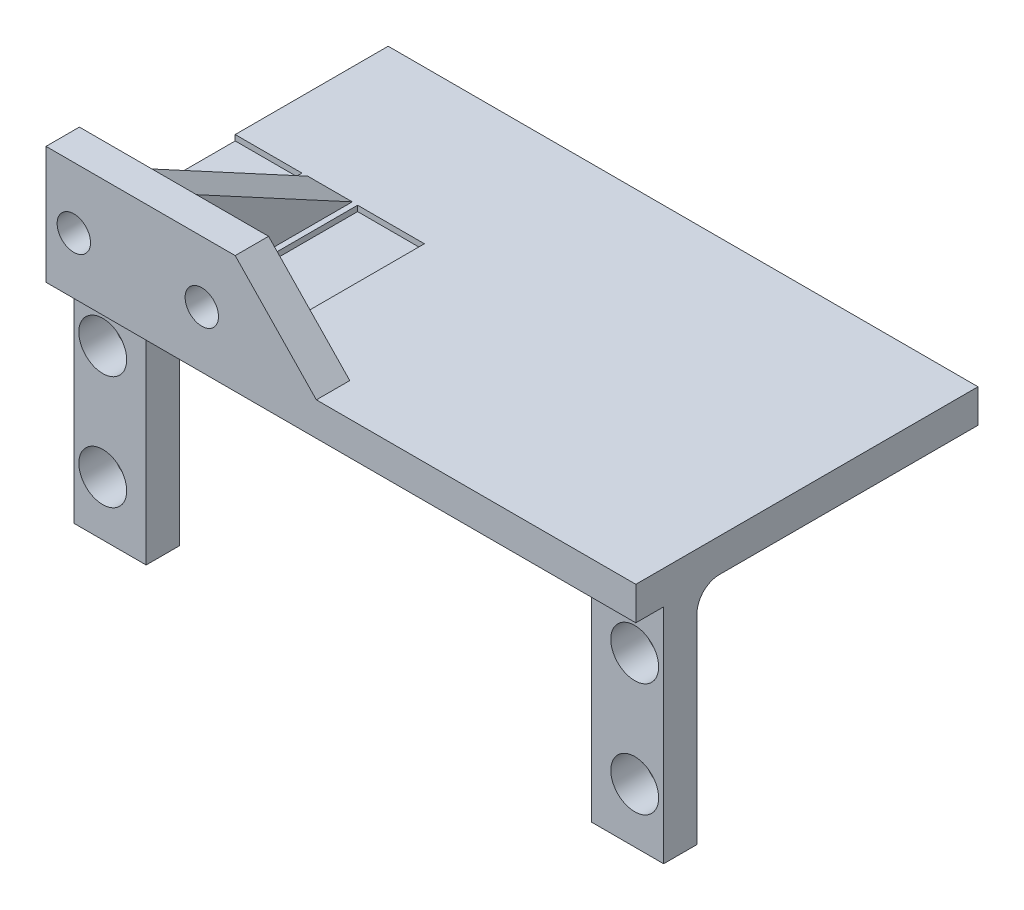
ISO-10303-21;
HEADER;
FILE_DESCRIPTION(('STEP AP214'),'2;1');
FILE_NAME('part.step','',(''),(''),'','','');
FILE_SCHEMA(('AUTOMOTIVE_DESIGN { 1 0 10303 214 1 1 1 1 }'));
ENDSEC;
DATA;
#1=APPLICATION_CONTEXT('core data for automotive mechanical design processes');
#2=APPLICATION_PROTOCOL_DEFINITION('international standard','automotive_design',2000,#1);
#3=PRODUCT_CONTEXT('',#1,'mechanical');
#4=PRODUCT('Part','Part','',(#3));
#5=PRODUCT_RELATED_PRODUCT_CATEGORY('part','',(#4));
#6=PRODUCT_DEFINITION_FORMATION('','',#4);
#7=PRODUCT_DEFINITION_CONTEXT('part definition',#1,'design');
#8=PRODUCT_DEFINITION('design','',#6,#7);
#9=PRODUCT_DEFINITION_SHAPE('','',#8);
#10=(LENGTH_UNIT() NAMED_UNIT(*) SI_UNIT(.MILLI.,.METRE.));
#11=(NAMED_UNIT(*) PLANE_ANGLE_UNIT() SI_UNIT($,.RADIAN.));
#12=(NAMED_UNIT(*) SI_UNIT($,.STERADIAN.) SOLID_ANGLE_UNIT());
#13=UNCERTAINTY_MEASURE_WITH_UNIT(LENGTH_MEASURE(1.E-05),#10,'distance_accuracy_value','');
#14=(GEOMETRIC_REPRESENTATION_CONTEXT(3) GLOBAL_UNCERTAINTY_ASSIGNED_CONTEXT((#13)) GLOBAL_UNIT_ASSIGNED_CONTEXT((#10,
#11,#12)) REPRESENTATION_CONTEXT('',''));
#15=CARTESIAN_POINT('',(0.,0.,0.));
#16=DIRECTION('',(0.,0.,1.));
#17=DIRECTION('',(1.,0.,0.));
#18=AXIS2_PLACEMENT_3D('',#15,#16,#17);
#19=CARTESIAN_POINT('',(0.,3.,0.));
#20=DIRECTION('',(0.,1.,0.));
#21=DIRECTION('',(0.,0.,1.));
#22=AXIS2_PLACEMENT_3D('',#19,#20,#21);
#23=PLANE('',#22);
#24=DIRECTION('',(0.,0.,1.));
#25=VECTOR('',#24,1.);
#26=CARTESIAN_POINT('',(21.9121082102589,3.,34.4908925903216));
#27=LINE('',#26,#25);
#28=CARTESIAN_POINT('',(21.9121082102589,3.,34.4908925903216));
#29=VERTEX_POINT('',#28);
#30=CARTESIAN_POINT('',(21.9121082102589,3.,37.4908925903216));
#31=VERTEX_POINT('',#30);
#32=EDGE_CURVE('E52',#29,#31,#27,.T.);
#33=ORIENTED_EDGE('',*,*,#32,.T.);
#34=DIRECTION('',(1.,0.,0.));
#35=VECTOR('',#34,1.);
#36=CARTESIAN_POINT('',(-2.38191084480889,3.,37.4908925903216));
#37=LINE('',#36,#35);
#38=CARTESIAN_POINT('',(50.6180891551911,3.,37.4908925903216));
#39=VERTEX_POINT('',#38);
#40=EDGE_CURVE('E407',#31,#39,#37,.T.);
#41=ORIENTED_EDGE('',*,*,#40,.T.);
#42=DIRECTION('',(0.,0.,-1.));
#43=VECTOR('',#42,1.);
#44=CARTESIAN_POINT('',(50.6180891551911,3.,6.74530636270987));
#45=LINE('',#44,#43);
#46=CARTESIAN_POINT('',(50.6180891551911,3.,6.74530636270987));
#47=VERTEX_POINT('',#46);
#48=EDGE_CURVE('E410',#39,#47,#45,.T.);
#49=ORIENTED_EDGE('',*,*,#48,.T.);
#50=DIRECTION('',(-1.,0.,0.));
#51=VECTOR('',#50,1.);
#52=CARTESIAN_POINT('',(-2.3819108448089,3.,6.74530636270987));
#53=LINE('',#52,#51);
#54=CARTESIAN_POINT('',(-2.3819108448089,3.,6.74530636270987));
#55=VERTEX_POINT('',#54);
#56=EDGE_CURVE('E412',#47,#55,#53,.T.);
#57=ORIENTED_EDGE('',*,*,#56,.T.);
#58=DIRECTION('',(0.,0.,1.));
#59=VECTOR('',#58,1.);
#60=CARTESIAN_POINT('',(-2.3819108448089,3.,6.74530636270987));
#61=LINE('',#60,#59);
#62=CARTESIAN_POINT('',(-2.3819108448089,3.,20.4908925903216));
#63=VERTEX_POINT('',#62);
#64=EDGE_CURVE('E404',#55,#63,#61,.T.);
#65=ORIENTED_EDGE('',*,*,#64,.T.);
#66=DIRECTION('',(1.,0.,0.));
#67=VECTOR('',#66,1.);
#68=CARTESIAN_POINT('',(0.,3.,20.4908925903216));
#69=LINE('',#68,#67);
#70=CARTESIAN_POINT('',(3.6180891551911,3.,20.4908925903216));
#71=VERTEX_POINT('',#70);
#72=EDGE_CURVE('E297',#63,#71,#69,.T.);
#73=ORIENTED_EDGE('',*,*,#72,.T.);
#74=DIRECTION('',(0.,0.,-1.));
#75=VECTOR('',#74,1.);
#76=CARTESIAN_POINT('',(3.6180891551911,3.,0.));
#77=LINE('',#76,#75);
#78=CARTESIAN_POINT('',(3.6180891551911,3.,34.4908925903216));
#79=VERTEX_POINT('',#78);
#80=EDGE_CURVE('E260',#79,#71,#77,.T.);
#81=ORIENTED_EDGE('',*,*,#80,.F.);
#82=DIRECTION('',(1.,0.,0.));
#83=VECTOR('',#82,1.);
#84=CARTESIAN_POINT('',(-2.38191084480889,3.,34.4908925903216));
#85=LINE('',#84,#83);
#86=CARTESIAN_POINT('',(4.11808915519111,3.,34.4908925903216));
#87=VERTEX_POINT('',#86);
#88=EDGE_CURVE('E223',#79,#87,#85,.T.);
#89=ORIENTED_EDGE('',*,*,#88,.T.);
#90=DIRECTION('',(0.,0.,1.));
#91=VECTOR('',#90,1.);
#92=CARTESIAN_POINT('',(4.11808915519111,3.,34.4908925903216));
#93=LINE('',#92,#91);
#94=CARTESIAN_POINT('',(4.1180891551911,3.,20.4689209894298));
#95=VERTEX_POINT('',#94);
#96=EDGE_CURVE('E244',#95,#87,#93,.T.);
#97=ORIENTED_EDGE('',*,*,#96,.F.);
#98=DIRECTION('',(-1.,0.,0.));
#99=VECTOR('',#98,1.);
#100=CARTESIAN_POINT('',(8.11808915519111,3.,20.4689209894298));
#101=LINE('',#100,#99);
#102=CARTESIAN_POINT('',(8.11808915519111,3.,20.4689209894298));
#103=VERTEX_POINT('',#102);
#104=EDGE_CURVE('E256',#103,#95,#101,.T.);
#105=ORIENTED_EDGE('',*,*,#104,.F.);
#106=DIRECTION('',(0.,0.,1.));
#107=VECTOR('',#106,1.);
#108=CARTESIAN_POINT('',(8.11808915519111,3.,34.4908925903216));
#109=LINE('',#108,#107);
#110=CARTESIAN_POINT('',(8.11808915519111,3.,34.4908925903216));
#111=VERTEX_POINT('',#110);
#112=EDGE_CURVE('E251',#103,#111,#109,.T.);
#113=ORIENTED_EDGE('',*,*,#112,.T.);
#114=CARTESIAN_POINT('',(8.61808915519111,3.,34.4908925903216));
#115=VERTEX_POINT('',#114);
#116=EDGE_CURVE('E322',#111,#115,#85,.T.);
#117=ORIENTED_EDGE('',*,*,#116,.T.);
#118=DIRECTION('',(0.,0.,-1.));
#119=VECTOR('',#118,1.);
#120=CARTESIAN_POINT('',(8.61808915519111,3.,0.));
#121=LINE('',#120,#119);
#122=CARTESIAN_POINT('',(8.61808915519111,3.,20.4908925903216));
#123=VERTEX_POINT('',#122);
#124=EDGE_CURVE('E275',#115,#123,#121,.T.);
#125=ORIENTED_EDGE('',*,*,#124,.T.);
#126=DIRECTION('',(-1.,0.,0.));
#127=VECTOR('',#126,1.);
#128=CARTESIAN_POINT('',(0.,3.,20.4908925903216));
#129=LINE('',#128,#127);
#130=CARTESIAN_POINT('',(14.6180891551911,3.,20.4908925903216));
#131=VERTEX_POINT('',#130);
#132=EDGE_CURVE('E265',#131,#123,#129,.T.);
#133=ORIENTED_EDGE('',*,*,#132,.F.);
#134=DIRECTION('',(0.,0.,-1.));
#135=VECTOR('',#134,1.);
#136=CARTESIAN_POINT('',(14.6180891551911,3.,0.));
#137=LINE('',#136,#135);
#138=CARTESIAN_POINT('',(14.6180891551911,3.,34.4908925903216));
#139=VERTEX_POINT('',#138);
#140=EDGE_CURVE('E278',#139,#131,#137,.T.);
#141=ORIENTED_EDGE('',*,*,#140,.F.);
#142=DIRECTION('',(1.,0.,0.));
#143=VECTOR('',#142,1.);
#144=CARTESIAN_POINT('',(14.6180891551911,3.,34.4908925903216));
#145=LINE('',#144,#143);
#146=EDGE_CURVE('E48',#139,#29,#145,.T.);
#147=ORIENTED_EDGE('',*,*,#146,.T.);
#148=EDGE_LOOP('',(#33,#41,#49,#57,#65,#73,#81,#89,#97,#105,#113,#117,#125,#133,#141,#147));
#149=FACE_BOUND('',#148,.T.);
#150=ADVANCED_FACE('F33',(#149),#23,.T.);
#151=CARTESIAN_POINT('',(0.,0.,0.));
#152=DIRECTION('',(0.,1.,0.));
#153=DIRECTION('',(0.,0.,1.));
#154=AXIS2_PLACEMENT_3D('',#151,#152,#153);
#155=PLANE('',#154);
#156=DIRECTION('',(0.,0.,-1.));
#157=VECTOR('',#156,1.);
#158=CARTESIAN_POINT('',(50.6180891551911,0.,6.74530636270987));
#159=LINE('',#158,#157);
#160=CARTESIAN_POINT('',(50.6180891551911,0.,29.9908925903216));
#161=VERTEX_POINT('',#160);
#162=CARTESIAN_POINT('',(50.6180891551911,0.,6.74530636270987));
#163=VERTEX_POINT('',#162);
#164=EDGE_CURVE('E420',#161,#163,#159,.T.);
#165=ORIENTED_EDGE('',*,*,#164,.F.);
#166=DIRECTION('',(1.,0.,0.));
#167=VECTOR('',#166,1.);
#168=CARTESIAN_POINT('',(44.1180891551911,0.,29.9908925903216));
#169=LINE('',#168,#167);
#170=CARTESIAN_POINT('',(44.1180891551911,0.,29.9908925903216));
#171=VERTEX_POINT('',#170);
#172=EDGE_CURVE('E445',#161,#171,#169,.F.);
#173=ORIENTED_EDGE('',*,*,#172,.T.);
#174=DIRECTION('',(0.,0.,-1.));
#175=VECTOR('',#174,1.);
#176=CARTESIAN_POINT('',(44.1180891551911,0.,34.9908925903216));
#177=LINE('',#176,#175);
#178=CARTESIAN_POINT('',(44.1180891551911,0.,34.9908925903216));
#179=VERTEX_POINT('',#178);
#180=EDGE_CURVE('E382',#179,#171,#177,.T.);
#181=ORIENTED_EDGE('',*,*,#180,.F.);
#182=DIRECTION('',(-1.,0.,0.));
#183=VECTOR('',#182,1.);
#184=CARTESIAN_POINT('',(50.6180891551911,0.,34.9908925903216));
#185=LINE('',#184,#183);
#186=CARTESIAN_POINT('',(50.6180891551911,0.,34.9908925903216));
#187=VERTEX_POINT('',#186);
#188=EDGE_CURVE('E377',#187,#179,#185,.T.);
#189=ORIENTED_EDGE('',*,*,#188,.F.);
#190=CARTESIAN_POINT('',(50.6180891551911,0.,37.4908925903216));
#191=VERTEX_POINT('',#190);
#192=EDGE_CURVE('E421',#191,#187,#159,.T.);
#193=ORIENTED_EDGE('',*,*,#192,.F.);
#194=DIRECTION('',(1.,0.,0.));
#195=VECTOR('',#194,1.);
#196=CARTESIAN_POINT('',(-2.38191084480889,0.,37.4908925903216));
#197=LINE('',#196,#195);
#198=CARTESIAN_POINT('',(-2.38191084480889,0.,37.4908925903216));
#199=VERTEX_POINT('',#198);
#200=EDGE_CURVE('E418',#199,#191,#197,.T.);
#201=ORIENTED_EDGE('',*,*,#200,.F.);
#202=DIRECTION('',(0.,0.,1.));
#203=VECTOR('',#202,1.);
#204=CARTESIAN_POINT('',(-2.3819108448089,0.,6.74530636270987));
#205=LINE('',#204,#203);
#206=CARTESIAN_POINT('',(-2.38191084480889,0.,34.9908925903216));
#207=VERTEX_POINT('',#206);
#208=EDGE_CURVE('E403',#207,#199,#205,.T.);
#209=ORIENTED_EDGE('',*,*,#208,.F.);
#210=DIRECTION('',(-1.,0.,0.));
#211=VECTOR('',#210,1.);
#212=CARTESIAN_POINT('',(4.11808915519112,0.,34.9908925903216));
#213=LINE('',#212,#211);
#214=CARTESIAN_POINT('',(4.11808915519112,0.,34.9908925903216));
#215=VERTEX_POINT('',#214);
#216=EDGE_CURVE('E357',#215,#207,#213,.T.);
#217=ORIENTED_EDGE('',*,*,#216,.F.);
#218=DIRECTION('',(0.,0.,1.));
#219=VECTOR('',#218,1.);
#220=CARTESIAN_POINT('',(4.11808915519112,0.,34.9908925903216));
#221=LINE('',#220,#219);
#222=CARTESIAN_POINT('',(4.11808915519112,0.,29.9908925903216));
#223=VERTEX_POINT('',#222);
#224=EDGE_CURVE('E350',#223,#215,#221,.T.);
#225=ORIENTED_EDGE('',*,*,#224,.F.);
#226=DIRECTION('',(1.,0.,0.));
#227=VECTOR('',#226,1.);
#228=CARTESIAN_POINT('',(-2.38191084480889,0.,29.9908925903216));
#229=LINE('',#228,#227);
#230=CARTESIAN_POINT('',(-2.38191084480889,0.,29.9908925903216));
#231=VERTEX_POINT('',#230);
#232=EDGE_CURVE('E443',#223,#231,#229,.F.);
#233=ORIENTED_EDGE('',*,*,#232,.T.);
#234=CARTESIAN_POINT('',(-2.3819108448089,0.,6.74530636270987));
#235=VERTEX_POINT('',#234);
#236=EDGE_CURVE('E415',#235,#231,#205,.T.);
#237=ORIENTED_EDGE('',*,*,#236,.F.);
#238=DIRECTION('',(-1.,0.,0.));
#239=VECTOR('',#238,1.);
#240=CARTESIAN_POINT('',(-2.3819108448089,0.,6.74530636270987));
#241=LINE('',#240,#239);
#242=EDGE_CURVE('E408',#163,#235,#241,.T.);
#243=ORIENTED_EDGE('',*,*,#242,.F.);
#244=EDGE_LOOP('',(#165,#173,#181,#189,#193,#201,#209,#217,#225,#233,#237,#243));
#245=FACE_BOUND('',#244,.T.);
#246=ADVANCED_FACE('F468',(#245),#155,.F.);
#247=CARTESIAN_POINT('',(-2.3819108448089,3.,6.74530636270987));
#248=DIRECTION('',(1.,0.,0.));
#249=DIRECTION('',(0.,0.,-1.));
#250=AXIS2_PLACEMENT_3D('',#247,#248,#249);
#251=PLANE('',#250);
#252=DIRECTION('',(0.,-1.,0.));
#253=VECTOR('',#252,1.);
#254=CARTESIAN_POINT('',(-2.38191084480889,3.,34.4908925903216));
#255=LINE('',#254,#253);
#256=CARTESIAN_POINT('',(-2.38191084480889,10.58,34.4908925903216));
#257=VERTEX_POINT('',#256);
#258=CARTESIAN_POINT('',(-2.38191084480889,2.5,34.4908925903216));
#259=VERTEX_POINT('',#258);
#260=EDGE_CURVE('E219',#257,#259,#255,.T.);
#261=ORIENTED_EDGE('',*,*,#260,.T.);
#262=DIRECTION('',(0.,0.,1.));
#263=VECTOR('',#262,1.);
#264=CARTESIAN_POINT('',(-2.3819108448089,2.5,0.));
#265=LINE('',#264,#263);
#266=CARTESIAN_POINT('',(-2.3819108448089,2.5,20.4908925903216));
#267=VERTEX_POINT('',#266);
#268=EDGE_CURVE('E302',#267,#259,#265,.T.);
#269=ORIENTED_EDGE('',*,*,#268,.F.);
#270=DIRECTION('',(0.,1.,0.));
#271=VECTOR('',#270,1.);
#272=CARTESIAN_POINT('',(-2.3819108448089,2.5,20.4908925903216));
#273=LINE('',#272,#271);
#274=EDGE_CURVE('E279',#267,#63,#273,.T.);
#275=ORIENTED_EDGE('',*,*,#274,.T.);
#276=ORIENTED_EDGE('',*,*,#64,.F.);
#277=DIRECTION('',(0.,-1.,0.));
#278=VECTOR('',#277,1.);
#279=CARTESIAN_POINT('',(-2.3819108448089,3.,6.74530636270987));
#280=LINE('',#279,#278);
#281=EDGE_CURVE('E414',#55,#235,#280,.T.);
#282=ORIENTED_EDGE('',*,*,#281,.T.);
#283=ORIENTED_EDGE('',*,*,#236,.T.);
#284=CARTESIAN_POINT('',(-2.38191084480889,-2.,29.9908925903216));
#285=DIRECTION('',(1.,0.,0.));
#286=DIRECTION('',(0.,0.,-1.));
#287=AXIS2_PLACEMENT_3D('',#284,#285,#286);
#288=CIRCLE('',#287,2.);
#289=CARTESIAN_POINT('',(-2.38191084480889,-2.,31.9908925903216));
#290=VERTEX_POINT('',#289);
#291=EDGE_CURVE('E11',#231,#290,#288,.T.);
#292=ORIENTED_EDGE('',*,*,#291,.T.);
#293=DIRECTION('',(0.,1.,0.));
#294=VECTOR('',#293,1.);
#295=CARTESIAN_POINT('',(-2.38191084480889,-20.,31.9908925903216));
#296=LINE('',#295,#294);
#297=CARTESIAN_POINT('',(-2.38191084480889,-20.,31.9908925903216));
#298=VERTEX_POINT('',#297);
#299=EDGE_CURVE('E370',#298,#290,#296,.T.);
#300=ORIENTED_EDGE('',*,*,#299,.F.);
#301=DIRECTION('',(0.,0.,-1.));
#302=VECTOR('',#301,1.);
#303=CARTESIAN_POINT('',(-2.38191084480889,-20.,34.9908925903216));
#304=LINE('',#303,#302);
#305=CARTESIAN_POINT('',(-2.38191084480889,-20.,34.9908925903216));
#306=VERTEX_POINT('',#305);
#307=EDGE_CURVE('E359',#306,#298,#304,.T.);
#308=ORIENTED_EDGE('',*,*,#307,.F.);
#309=DIRECTION('',(0.,1.,0.));
#310=VECTOR('',#309,1.);
#311=CARTESIAN_POINT('',(-2.38191084480889,-20.,34.9908925903216));
#312=LINE('',#311,#310);
#313=EDGE_CURVE('E373',#306,#207,#312,.T.);
#314=ORIENTED_EDGE('',*,*,#313,.T.);
#315=ORIENTED_EDGE('',*,*,#208,.T.);
#316=DIRECTION('',(0.,-1.,0.));
#317=VECTOR('',#316,1.);
#318=CARTESIAN_POINT('',(-2.38191084480889,3.,37.4908925903216));
#319=LINE('',#318,#317);
#320=CARTESIAN_POINT('',(-2.38191084480889,10.58,37.4908925903216));
#321=VERTEX_POINT('',#320);
#322=EDGE_CURVE('E433',#321,#199,#319,.T.);
#323=ORIENTED_EDGE('',*,*,#322,.F.);
#324=DIRECTION('',(0.,0.,1.));
#325=VECTOR('',#324,1.);
#326=CARTESIAN_POINT('',(-2.38191084480889,10.58,34.4908925903216));
#327=LINE('',#326,#325);
#328=EDGE_CURVE('E232',#257,#321,#327,.T.);
#329=ORIENTED_EDGE('',*,*,#328,.F.);
#330=EDGE_LOOP('',(#261,#269,#275,#276,#282,#283,#292,#300,#308,#314,#315,#323,#329));
#331=FACE_BOUND('',#330,.T.);
#332=ADVANCED_FACE('F471',(#331),#251,.F.);
#333=CARTESIAN_POINT('',(-2.38191084480889,3.,37.4908925903216));
#334=DIRECTION('',(0.,0.,-1.));
#335=DIRECTION('',(-1.,0.,0.));
#336=AXIS2_PLACEMENT_3D('',#333,#334,#335);
#337=PLANE('',#336);
#338=ORIENTED_EDGE('',*,*,#40,.F.);
#339=DIRECTION('',(-0.693383174984069,0.72056906167904,0.));
#340=VECTOR('',#339,1.);
#341=CARTESIAN_POINT('',(21.9121082102589,3.,37.4908925903216));
#342=LINE('',#341,#340);
#343=CARTESIAN_POINT('',(14.6180891551911,10.58,37.4908925903216));
#344=VERTEX_POINT('',#343);
#345=EDGE_CURVE('E238',#31,#344,#342,.T.);
#346=ORIENTED_EDGE('',*,*,#345,.T.);
#347=DIRECTION('',(-1.,0.,0.));
#348=VECTOR('',#347,1.);
#349=CARTESIAN_POINT('',(-2.38191084480889,10.58,37.4908925903216));
#350=LINE('',#349,#348);
#351=EDGE_CURVE('E228',#344,#321,#350,.T.);
#352=ORIENTED_EDGE('',*,*,#351,.T.);
#353=ORIENTED_EDGE('',*,*,#322,.T.);
#354=ORIENTED_EDGE('',*,*,#200,.T.);
#355=DIRECTION('',(0.,-1.,0.));
#356=VECTOR('',#355,1.);
#357=CARTESIAN_POINT('',(50.6180891551911,3.,37.4908925903216));
#358=LINE('',#357,#356);
#359=EDGE_CURVE('E430',#39,#191,#358,.T.);
#360=ORIENTED_EDGE('',*,*,#359,.F.);
#361=EDGE_LOOP('',(#338,#346,#352,#353,#354,#360));
#362=FACE_BOUND('',#361,.T.);
#363=CARTESIAN_POINT('',(0.118089155191028,5.08124193159212,37.4908925903216));
#364=DIRECTION('',(0.,0.,1.));
#365=DIRECTION('',(1.,0.,0.));
#366=AXIS2_PLACEMENT_3D('',#363,#364,#365);
#367=CIRCLE('',#366,1.5);
#368=CARTESIAN_POINT('',(1.61808915519103,5.08124193159212,37.4908925903216));
#369=VERTEX_POINT('',#368);
#370=EDGE_CURVE('E315',#369,#369,#367,.T.);
#371=ORIENTED_EDGE('',*,*,#370,.F.);
#372=EDGE_LOOP('',(#371));
#373=FACE_BOUND('',#372,.T.);
#374=CARTESIAN_POINT('',(11.618089155191,5.08124193159214,37.4908925903216));
#375=DIRECTION('',(0.,0.,1.));
#376=DIRECTION('',(1.,0.,0.));
#377=AXIS2_PLACEMENT_3D('',#374,#375,#376);
#378=CIRCLE('',#377,1.5);
#379=CARTESIAN_POINT('',(13.118089155191,5.08124193159214,37.4908925903216));
#380=VERTEX_POINT('',#379);
#381=EDGE_CURVE('E286',#380,#380,#378,.T.);
#382=ORIENTED_EDGE('',*,*,#381,.F.);
#383=EDGE_LOOP('',(#382));
#384=FACE_BOUND('',#383,.T.);
#385=ADVANCED_FACE('F506',(#362,#373,#384),#337,.F.);
#386=CARTESIAN_POINT('',(50.6180891551911,3.,6.74530636270987));
#387=DIRECTION('',(-1.,0.,0.));
#388=DIRECTION('',(0.,0.,1.));
#389=AXIS2_PLACEMENT_3D('',#386,#387,#388);
#390=PLANE('',#389);
#391=ORIENTED_EDGE('',*,*,#192,.T.);
#392=DIRECTION('',(0.,1.,0.));
#393=VECTOR('',#392,1.);
#394=CARTESIAN_POINT('',(50.6180891551911,-20.,34.9908925903216));
#395=LINE('',#394,#393);
#396=CARTESIAN_POINT('',(50.6180891551911,-20.,34.9908925903216));
#397=VERTEX_POINT('',#396);
#398=EDGE_CURVE('E400',#397,#187,#395,.T.);
#399=ORIENTED_EDGE('',*,*,#398,.F.);
#400=DIRECTION('',(0.,0.,1.));
#401=VECTOR('',#400,1.);
#402=CARTESIAN_POINT('',(50.6180891551911,-20.,34.9908925903216));
#403=LINE('',#402,#401);
#404=CARTESIAN_POINT('',(50.6180891551911,-20.,31.9908925903216));
#405=VERTEX_POINT('',#404);
#406=EDGE_CURVE('E378',#405,#397,#403,.T.);
#407=ORIENTED_EDGE('',*,*,#406,.F.);
#408=DIRECTION('',(0.,1.,0.));
#409=VECTOR('',#408,1.);
#410=CARTESIAN_POINT('',(50.6180891551911,-20.,31.9908925903216));
#411=LINE('',#410,#409);
#412=CARTESIAN_POINT('',(50.6180891551911,-2.,31.9908925903216));
#413=VERTEX_POINT('',#412);
#414=EDGE_CURVE('E388',#405,#413,#411,.T.);
#415=ORIENTED_EDGE('',*,*,#414,.T.);
#416=CARTESIAN_POINT('',(50.6180891551911,-2.,29.9908925903216));
#417=DIRECTION('',(-1.,0.,0.));
#418=DIRECTION('',(0.,0.,1.));
#419=AXIS2_PLACEMENT_3D('',#416,#417,#418);
#420=CIRCLE('',#419,2.);
#421=EDGE_CURVE('E451',#413,#161,#420,.T.);
#422=ORIENTED_EDGE('',*,*,#421,.T.);
#423=ORIENTED_EDGE('',*,*,#164,.T.);
#424=DIRECTION('',(0.,-1.,0.));
#425=VECTOR('',#424,1.);
#426=CARTESIAN_POINT('',(50.6180891551911,3.,6.74530636270987));
#427=LINE('',#426,#425);
#428=EDGE_CURVE('E427',#47,#163,#427,.T.);
#429=ORIENTED_EDGE('',*,*,#428,.F.);
#430=ORIENTED_EDGE('',*,*,#48,.F.);
#431=ORIENTED_EDGE('',*,*,#359,.T.);
#432=EDGE_LOOP('',(#391,#399,#407,#415,#422,#423,#429,#430,#431));
#433=FACE_BOUND('',#432,.T.);
#434=ADVANCED_FACE('F502',(#433),#390,.F.);
#435=CARTESIAN_POINT('',(-2.3819108448089,3.,6.74530636270987));
#436=DIRECTION('',(0.,0.,1.));
#437=DIRECTION('',(1.,0.,0.));
#438=AXIS2_PLACEMENT_3D('',#435,#436,#437);
#439=PLANE('',#438);
#440=ORIENTED_EDGE('',*,*,#242,.T.);
#441=ORIENTED_EDGE('',*,*,#281,.F.);
#442=ORIENTED_EDGE('',*,*,#56,.F.);
#443=ORIENTED_EDGE('',*,*,#428,.T.);
#444=EDGE_LOOP('',(#440,#441,#442,#443));
#445=FACE_BOUND('',#444,.T.);
#446=ADVANCED_FACE('F477',(#445),#439,.F.);
#447=CARTESIAN_POINT('',(50.6180891551911,-20.,34.9908925903216));
#448=DIRECTION('',(0.,0.,-1.));
#449=DIRECTION('',(-1.,0.,0.));
#450=AXIS2_PLACEMENT_3D('',#447,#448,#449);
#451=PLANE('',#450);
#452=CARTESIAN_POINT('',(48.0180891551911,-4.90000000000001,34.9908925903216));
#453=DIRECTION('',(0.,0.,1.));
#454=DIRECTION('',(1.,0.,0.));
#455=AXIS2_PLACEMENT_3D('',#452,#453,#454);
#456=CIRCLE('',#455,2.15);
#457=CARTESIAN_POINT('',(50.1680891551911,-4.90000000000001,34.9908925903216));
#458=VERTEX_POINT('',#457);
#459=EDGE_CURVE('E339',#458,#458,#456,.T.);
#460=ORIENTED_EDGE('',*,*,#459,.F.);
#461=EDGE_LOOP('',(#460));
#462=FACE_BOUND('',#461,.T.);
#463=CARTESIAN_POINT('',(48.0180891551911,-15.1,34.9908925903216));
#464=DIRECTION('',(0.,0.,1.));
#465=DIRECTION('',(1.,0.,0.));
#466=AXIS2_PLACEMENT_3D('',#463,#464,#465);
#467=CIRCLE('',#466,2.15);
#468=CARTESIAN_POINT('',(50.1680891551911,-15.1,34.9908925903216));
#469=VERTEX_POINT('',#468);
#470=EDGE_CURVE('E338',#469,#469,#467,.T.);
#471=ORIENTED_EDGE('',*,*,#470,.F.);
#472=EDGE_LOOP('',(#471));
#473=FACE_BOUND('',#472,.T.);
#474=ORIENTED_EDGE('',*,*,#188,.T.);
#475=DIRECTION('',(0.,1.,0.));
#476=VECTOR('',#475,1.);
#477=CARTESIAN_POINT('',(44.1180891551911,-20.,34.9908925903216));
#478=LINE('',#477,#476);
#479=CARTESIAN_POINT('',(44.1180891551911,-20.,34.9908925903216));
#480=VERTEX_POINT('',#479);
#481=EDGE_CURVE('E397',#480,#179,#478,.T.);
#482=ORIENTED_EDGE('',*,*,#481,.F.);
#483=DIRECTION('',(-1.,0.,0.));
#484=VECTOR('',#483,1.);
#485=CARTESIAN_POINT('',(50.6180891551911,-20.,34.9908925903216));
#486=LINE('',#485,#484);
#487=EDGE_CURVE('E381',#397,#480,#486,.T.);
#488=ORIENTED_EDGE('',*,*,#487,.F.);
#489=ORIENTED_EDGE('',*,*,#398,.T.);
#490=EDGE_LOOP('',(#474,#482,#488,#489));
#491=FACE_BOUND('',#490,.T.);
#492=ADVANCED_FACE('F499',(#462,#473,#491),#451,.F.);
#493=CARTESIAN_POINT('',(44.1180891551911,-20.,34.9908925903216));
#494=DIRECTION('',(1.,0.,0.));
#495=DIRECTION('',(0.,0.,-1.));
#496=AXIS2_PLACEMENT_3D('',#493,#494,#495);
#497=PLANE('',#496);
#498=ORIENTED_EDGE('',*,*,#180,.T.);
#499=CARTESIAN_POINT('',(44.1180891551911,-2.,29.9908925903216));
#500=DIRECTION('',(1.,0.,0.));
#501=DIRECTION('',(0.,0.,-1.));
#502=AXIS2_PLACEMENT_3D('',#499,#500,#501);
#503=CIRCLE('',#502,2.);
#504=CARTESIAN_POINT('',(44.1180891551911,-2.,31.9908925903216));
#505=VERTEX_POINT('',#504);
#506=EDGE_CURVE('E453',#171,#505,#503,.T.);
#507=ORIENTED_EDGE('',*,*,#506,.T.);
#508=DIRECTION('',(0.,1.,0.));
#509=VECTOR('',#508,1.);
#510=CARTESIAN_POINT('',(44.1180891551911,-20.,31.9908925903216));
#511=LINE('',#510,#509);
#512=CARTESIAN_POINT('',(44.1180891551911,-20.,31.9908925903216));
#513=VERTEX_POINT('',#512);
#514=EDGE_CURVE('E394',#513,#505,#511,.T.);
#515=ORIENTED_EDGE('',*,*,#514,.F.);
#516=DIRECTION('',(0.,0.,-1.));
#517=VECTOR('',#516,1.);
#518=CARTESIAN_POINT('',(44.1180891551911,-20.,34.9908925903216));
#519=LINE('',#518,#517);
#520=EDGE_CURVE('E384',#480,#513,#519,.T.);
#521=ORIENTED_EDGE('',*,*,#520,.F.);
#522=ORIENTED_EDGE('',*,*,#481,.T.);
#523=EDGE_LOOP('',(#498,#507,#515,#521,#522));
#524=FACE_BOUND('',#523,.T.);
#525=ADVANCED_FACE('F487',(#524),#497,.F.);
#526=CARTESIAN_POINT('',(50.6180891551911,-20.,31.9908925903216));
#527=DIRECTION('',(0.,0.,1.));
#528=DIRECTION('',(1.,0.,0.));
#529=AXIS2_PLACEMENT_3D('',#526,#527,#528);
#530=PLANE('',#529);
#531=CARTESIAN_POINT('',(48.0180891551911,-4.90000000000001,31.9908925903216));
#532=DIRECTION('',(0.,0.,1.));
#533=DIRECTION('',(1.,0.,0.));
#534=AXIS2_PLACEMENT_3D('',#531,#532,#533);
#535=CIRCLE('',#534,2.15);
#536=CARTESIAN_POINT('',(50.1680891551911,-4.90000000000001,31.9908925903216));
#537=VERTEX_POINT('',#536);
#538=EDGE_CURVE('E335',#537,#537,#535,.T.);
#539=ORIENTED_EDGE('',*,*,#538,.T.);
#540=EDGE_LOOP('',(#539));
#541=FACE_BOUND('',#540,.T.);
#542=CARTESIAN_POINT('',(48.0180891551911,-15.1,31.9908925903216));
#543=DIRECTION('',(0.,0.,1.));
#544=DIRECTION('',(1.,0.,0.));
#545=AXIS2_PLACEMENT_3D('',#542,#543,#544);
#546=CIRCLE('',#545,2.15);
#547=CARTESIAN_POINT('',(50.1680891551911,-15.1,31.9908925903216));
#548=VERTEX_POINT('',#547);
#549=EDGE_CURVE('E347',#548,#548,#546,.T.);
#550=ORIENTED_EDGE('',*,*,#549,.T.);
#551=EDGE_LOOP('',(#550));
#552=FACE_BOUND('',#551,.T.);
#553=ORIENTED_EDGE('',*,*,#514,.T.);
#554=DIRECTION('',(1.,0.,0.));
#555=VECTOR('',#554,1.);
#556=CARTESIAN_POINT('',(50.6180891551911,-2.,31.9908925903216));
#557=LINE('',#556,#555);
#558=EDGE_CURVE('E436',#505,#413,#557,.T.);
#559=ORIENTED_EDGE('',*,*,#558,.T.);
#560=ORIENTED_EDGE('',*,*,#414,.F.);
#561=DIRECTION('',(1.,0.,0.));
#562=VECTOR('',#561,1.);
#563=CARTESIAN_POINT('',(50.6180891551911,-20.,31.9908925903216));
#564=LINE('',#563,#562);
#565=EDGE_CURVE('E386',#513,#405,#564,.T.);
#566=ORIENTED_EDGE('',*,*,#565,.F.);
#567=EDGE_LOOP('',(#553,#559,#560,#566));
#568=FACE_BOUND('',#567,.T.);
#569=ADVANCED_FACE('F491',(#541,#552,#568),#530,.F.);
#570=CARTESIAN_POINT('',(0.,-20.,0.));
#571=DIRECTION('',(0.,1.,0.));
#572=DIRECTION('',(0.,0.,1.));
#573=AXIS2_PLACEMENT_3D('',#570,#571,#572);
#574=PLANE('',#573);
#575=ORIENTED_EDGE('',*,*,#406,.T.);
#576=ORIENTED_EDGE('',*,*,#487,.T.);
#577=ORIENTED_EDGE('',*,*,#520,.T.);
#578=ORIENTED_EDGE('',*,*,#565,.T.);
#579=EDGE_LOOP('',(#575,#576,#577,#578));
#580=FACE_BOUND('',#579,.T.);
#581=ADVANCED_FACE('F495',(#580),#574,.F.);
#582=CARTESIAN_POINT('',(4.11808915519112,-20.,34.9908925903216));
#583=DIRECTION('',(-1.,0.,0.));
#584=DIRECTION('',(0.,0.,1.));
#585=AXIS2_PLACEMENT_3D('',#582,#583,#584);
#586=PLANE('',#585);
#587=ORIENTED_EDGE('',*,*,#224,.T.);
#588=DIRECTION('',(0.,1.,0.));
#589=VECTOR('',#588,1.);
#590=CARTESIAN_POINT('',(4.11808915519112,-20.,34.9908925903216));
#591=LINE('',#590,#589);
#592=CARTESIAN_POINT('',(4.11808915519112,-20.,34.9908925903216));
#593=VERTEX_POINT('',#592);
#594=EDGE_CURVE('E375',#593,#215,#591,.T.);
#595=ORIENTED_EDGE('',*,*,#594,.F.);
#596=DIRECTION('',(0.,0.,1.));
#597=VECTOR('',#596,1.);
#598=CARTESIAN_POINT('',(4.11808915519112,-20.,34.9908925903216));
#599=LINE('',#598,#597);
#600=CARTESIAN_POINT('',(4.11808915519112,-20.,31.9908925903216));
#601=VERTEX_POINT('',#600);
#602=EDGE_CURVE('E353',#601,#593,#599,.T.);
#603=ORIENTED_EDGE('',*,*,#602,.F.);
#604=DIRECTION('',(0.,1.,0.));
#605=VECTOR('',#604,1.);
#606=CARTESIAN_POINT('',(4.11808915519112,-20.,31.9908925903216));
#607=LINE('',#606,#605);
#608=CARTESIAN_POINT('',(4.11808915519112,-2.,31.9908925903216));
#609=VERTEX_POINT('',#608);
#610=EDGE_CURVE('E363',#601,#609,#607,.T.);
#611=ORIENTED_EDGE('',*,*,#610,.T.);
#612=CARTESIAN_POINT('',(4.11808915519112,-2.,29.9908925903216));
#613=DIRECTION('',(-1.,0.,0.));
#614=DIRECTION('',(0.,0.,1.));
#615=AXIS2_PLACEMENT_3D('',#612,#613,#614);
#616=CIRCLE('',#615,2.);
#617=EDGE_CURVE('E41',#609,#223,#616,.T.);
#618=ORIENTED_EDGE('',*,*,#617,.T.);
#619=EDGE_LOOP('',(#587,#595,#603,#611,#618));
#620=FACE_BOUND('',#619,.T.);
#621=ADVANCED_FACE('F457',(#620),#586,.F.);
#622=CARTESIAN_POINT('',(4.11808915519112,-20.,34.9908925903216));
#623=DIRECTION('',(0.,0.,-1.));
#624=DIRECTION('',(-1.,0.,0.));
#625=AXIS2_PLACEMENT_3D('',#622,#623,#624);
#626=PLANE('',#625);
#627=CARTESIAN_POINT('',(0.218089155191097,-15.1,34.9908925903216));
#628=DIRECTION('',(0.,0.,1.));
#629=DIRECTION('',(1.,0.,0.));
#630=AXIS2_PLACEMENT_3D('',#627,#628,#629);
#631=CIRCLE('',#630,2.15);
#632=CARTESIAN_POINT('',(2.3680891551911,-15.1,34.9908925903216));
#633=VERTEX_POINT('',#632);
#634=EDGE_CURVE('E332',#633,#633,#631,.T.);
#635=ORIENTED_EDGE('',*,*,#634,.F.);
#636=EDGE_LOOP('',(#635));
#637=FACE_BOUND('',#636,.T.);
#638=CARTESIAN_POINT('',(0.218089155191097,-4.90000000000001,34.9908925903216));
#639=DIRECTION('',(0.,0.,1.));
#640=DIRECTION('',(1.,0.,0.));
#641=AXIS2_PLACEMENT_3D('',#638,#639,#640);
#642=CIRCLE('',#641,2.15);
#643=CARTESIAN_POINT('',(2.3680891551911,-4.90000000000001,34.9908925903216));
#644=VERTEX_POINT('',#643);
#645=EDGE_CURVE('E327',#644,#644,#642,.T.);
#646=ORIENTED_EDGE('',*,*,#645,.F.);
#647=EDGE_LOOP('',(#646));
#648=FACE_BOUND('',#647,.T.);
#649=ORIENTED_EDGE('',*,*,#216,.T.);
#650=ORIENTED_EDGE('',*,*,#313,.F.);
#651=DIRECTION('',(-1.,0.,0.));
#652=VECTOR('',#651,1.);
#653=CARTESIAN_POINT('',(4.11808915519112,-20.,34.9908925903216));
#654=LINE('',#653,#652);
#655=EDGE_CURVE('E356',#593,#306,#654,.T.);
#656=ORIENTED_EDGE('',*,*,#655,.F.);
#657=ORIENTED_EDGE('',*,*,#594,.T.);
#658=EDGE_LOOP('',(#649,#650,#656,#657));
#659=FACE_BOUND('',#658,.T.);
#660=ADVANCED_FACE('F512',(#637,#648,#659),#626,.F.);
#661=CARTESIAN_POINT('',(4.11808915519112,-20.,31.9908925903216));
#662=DIRECTION('',(0.,0.,1.));
#663=DIRECTION('',(1.,0.,0.));
#664=AXIS2_PLACEMENT_3D('',#661,#662,#663);
#665=PLANE('',#664);
#666=CARTESIAN_POINT('',(0.218089155191097,-15.1,31.9908925903216));
#667=DIRECTION('',(0.,0.,1.));
#668=DIRECTION('',(1.,0.,0.));
#669=AXIS2_PLACEMENT_3D('',#666,#667,#668);
#670=CIRCLE('',#669,2.15);
#671=CARTESIAN_POINT('',(2.3680891551911,-15.1,31.9908925903216));
#672=VERTEX_POINT('',#671);
#673=EDGE_CURVE('E342',#672,#672,#670,.T.);
#674=ORIENTED_EDGE('',*,*,#673,.T.);
#675=EDGE_LOOP('',(#674));
#676=FACE_BOUND('',#675,.T.);
#677=CARTESIAN_POINT('',(0.218089155191097,-4.90000000000001,31.9908925903216));
#678=DIRECTION('',(0.,0.,1.));
#679=DIRECTION('',(1.,0.,0.));
#680=AXIS2_PLACEMENT_3D('',#677,#678,#679);
#681=CIRCLE('',#680,2.15);
#682=CARTESIAN_POINT('',(2.3680891551911,-4.90000000000001,31.9908925903216));
#683=VERTEX_POINT('',#682);
#684=EDGE_CURVE('E329',#683,#683,#681,.T.);
#685=ORIENTED_EDGE('',*,*,#684,.T.);
#686=EDGE_LOOP('',(#685));
#687=FACE_BOUND('',#686,.T.);
#688=ORIENTED_EDGE('',*,*,#299,.T.);
#689=DIRECTION('',(1.,0.,0.));
#690=VECTOR('',#689,1.);
#691=CARTESIAN_POINT('',(4.11808915519112,-2.,31.9908925903216));
#692=LINE('',#691,#690);
#693=EDGE_CURVE('E448',#290,#609,#692,.T.);
#694=ORIENTED_EDGE('',*,*,#693,.T.);
#695=ORIENTED_EDGE('',*,*,#610,.F.);
#696=DIRECTION('',(1.,0.,0.));
#697=VECTOR('',#696,1.);
#698=CARTESIAN_POINT('',(4.11808915519112,-20.,31.9908925903216));
#699=LINE('',#698,#697);
#700=EDGE_CURVE('E361',#298,#601,#699,.T.);
#701=ORIENTED_EDGE('',*,*,#700,.F.);
#702=EDGE_LOOP('',(#688,#694,#695,#701));
#703=FACE_BOUND('',#702,.T.);
#704=ADVANCED_FACE('F517',(#676,#687,#703),#665,.F.);
#705=CARTESIAN_POINT('',(0.,-20.,0.));
#706=DIRECTION('',(0.,1.,0.));
#707=DIRECTION('',(0.,0.,1.));
#708=AXIS2_PLACEMENT_3D('',#705,#706,#707);
#709=PLANE('',#708);
#710=ORIENTED_EDGE('',*,*,#602,.T.);
#711=ORIENTED_EDGE('',*,*,#655,.T.);
#712=ORIENTED_EDGE('',*,*,#307,.T.);
#713=ORIENTED_EDGE('',*,*,#700,.T.);
#714=EDGE_LOOP('',(#710,#711,#712,#713));
#715=FACE_BOUND('',#714,.T.);
#716=ADVANCED_FACE('F514',(#715),#709,.F.);
#717=CARTESIAN_POINT('',(0.218089155191097,-4.90000000000001,31.9908925903216));
#718=DIRECTION('',(0.,0.,1.));
#719=DIRECTION('',(1.,0.,0.));
#720=AXIS2_PLACEMENT_3D('',#717,#718,#719);
#721=CYLINDRICAL_SURFACE('',#720,2.15);
#722=ORIENTED_EDGE('',*,*,#684,.F.);
#723=EDGE_LOOP('',(#722));
#724=FACE_BOUND('',#723,.T.);
#725=ORIENTED_EDGE('',*,*,#645,.T.);
#726=EDGE_LOOP('',(#725));
#727=FACE_BOUND('',#726,.T.);
#728=ADVANCED_FACE('F525',(#724,#727),#721,.F.);
#729=CARTESIAN_POINT('',(0.218089155191097,-15.1,31.9908925903216));
#730=DIRECTION('',(0.,0.,1.));
#731=DIRECTION('',(1.,0.,0.));
#732=AXIS2_PLACEMENT_3D('',#729,#730,#731);
#733=CYLINDRICAL_SURFACE('',#732,2.15);
#734=ORIENTED_EDGE('',*,*,#673,.F.);
#735=EDGE_LOOP('',(#734));
#736=FACE_BOUND('',#735,.T.);
#737=ORIENTED_EDGE('',*,*,#634,.T.);
#738=EDGE_LOOP('',(#737));
#739=FACE_BOUND('',#738,.T.);
#740=ADVANCED_FACE('F600',(#736,#739),#733,.F.);
#741=CARTESIAN_POINT('',(48.0180891551911,-15.1,31.9908925903216));
#742=DIRECTION('',(0.,0.,1.));
#743=DIRECTION('',(1.,0.,0.));
#744=AXIS2_PLACEMENT_3D('',#741,#742,#743);
#745=CYLINDRICAL_SURFACE('',#744,2.15);
#746=ORIENTED_EDGE('',*,*,#549,.F.);
#747=EDGE_LOOP('',(#746));
#748=FACE_BOUND('',#747,.T.);
#749=ORIENTED_EDGE('',*,*,#470,.T.);
#750=EDGE_LOOP('',(#749));
#751=FACE_BOUND('',#750,.T.);
#752=ADVANCED_FACE('F604',(#748,#751),#745,.F.);
#753=CARTESIAN_POINT('',(48.0180891551911,-4.90000000000001,31.9908925903216));
#754=DIRECTION('',(0.,0.,1.));
#755=DIRECTION('',(1.,0.,0.));
#756=AXIS2_PLACEMENT_3D('',#753,#754,#755);
#757=CYLINDRICAL_SURFACE('',#756,2.15);
#758=ORIENTED_EDGE('',*,*,#538,.F.);
#759=EDGE_LOOP('',(#758));
#760=FACE_BOUND('',#759,.T.);
#761=ORIENTED_EDGE('',*,*,#459,.T.);
#762=EDGE_LOOP('',(#761));
#763=FACE_BOUND('',#762,.T.);
#764=ADVANCED_FACE('F597',(#760,#763),#757,.F.);
#765=CARTESIAN_POINT('',(-2.38191084480889,10.58,34.4908925903216));
#766=DIRECTION('',(0.,1.,0.));
#767=DIRECTION('',(0.,0.,1.));
#768=AXIS2_PLACEMENT_3D('',#765,#766,#767);
#769=PLANE('',#768);
#770=ORIENTED_EDGE('',*,*,#351,.F.);
#771=DIRECTION('',(0.,0.,1.));
#772=VECTOR('',#771,1.);
#773=CARTESIAN_POINT('',(14.6180891551911,10.58,34.4908925903216));
#774=LINE('',#773,#772);
#775=CARTESIAN_POINT('',(14.6180891551911,10.58,34.4908925903216));
#776=VERTEX_POINT('',#775);
#777=EDGE_CURVE('E222',#776,#344,#774,.T.);
#778=ORIENTED_EDGE('',*,*,#777,.F.);
#779=DIRECTION('',(-1.,0.,0.));
#780=VECTOR('',#779,1.);
#781=CARTESIAN_POINT('',(-2.38191084480889,10.58,34.4908925903216));
#782=LINE('',#781,#780);
#783=EDGE_CURVE('E211',#776,#257,#782,.T.);
#784=ORIENTED_EDGE('',*,*,#783,.T.);
#785=ORIENTED_EDGE('',*,*,#328,.T.);
#786=EDGE_LOOP('',(#770,#778,#784,#785));
#787=FACE_BOUND('',#786,.T.);
#788=ADVANCED_FACE('F226',(#787),#769,.T.);
#789=CARTESIAN_POINT('',(0.,0.,34.4908925903216));
#790=DIRECTION('',(0.,0.,-1.));
#791=DIRECTION('',(-1.,0.,0.));
#792=AXIS2_PLACEMENT_3D('',#789,#790,#791);
#793=PLANE('',#792);
#794=DIRECTION('',(0.,1.,0.));
#795=VECTOR('',#794,1.);
#796=CARTESIAN_POINT('',(8.11808915519111,10.5703339697527,34.4908925903216));
#797=LINE('',#796,#795);
#798=CARTESIAN_POINT('',(8.11808915519111,10.5703339697527,34.4908925903216));
#799=VERTEX_POINT('',#798);
#800=EDGE_CURVE('E254',#111,#799,#797,.T.);
#801=ORIENTED_EDGE('',*,*,#800,.T.);
#802=DIRECTION('',(-1.,0.,0.));
#803=VECTOR('',#802,1.);
#804=CARTESIAN_POINT('',(8.11808915519111,10.5703339697527,34.4908925903216));
#805=LINE('',#804,#803);
#806=CARTESIAN_POINT('',(4.11808915519111,10.5703339697527,34.4908925903216));
#807=VERTEX_POINT('',#806);
#808=EDGE_CURVE('E257',#799,#807,#805,.T.);
#809=ORIENTED_EDGE('',*,*,#808,.T.);
#810=DIRECTION('',(0.,1.,0.));
#811=VECTOR('',#810,1.);
#812=CARTESIAN_POINT('',(4.11808915519111,10.5703339697527,34.4908925903216));
#813=LINE('',#812,#811);
#814=EDGE_CURVE('E246',#87,#807,#813,.T.);
#815=ORIENTED_EDGE('',*,*,#814,.F.);
#816=ORIENTED_EDGE('',*,*,#88,.F.);
#817=DIRECTION('',(0.,1.,0.));
#818=VECTOR('',#817,1.);
#819=CARTESIAN_POINT('',(3.6180891551911,2.5,34.4908925903216));
#820=LINE('',#819,#818);
#821=CARTESIAN_POINT('',(3.6180891551911,2.5,34.4908925903216));
#822=VERTEX_POINT('',#821);
#823=EDGE_CURVE('E305',#822,#79,#820,.T.);
#824=ORIENTED_EDGE('',*,*,#823,.F.);
#825=DIRECTION('',(1.,0.,0.));
#826=VECTOR('',#825,1.);
#827=CARTESIAN_POINT('',(0.,2.5,34.4908925903216));
#828=LINE('',#827,#826);
#829=EDGE_CURVE('E293',#259,#822,#828,.T.);
#830=ORIENTED_EDGE('',*,*,#829,.F.);
#831=ORIENTED_EDGE('',*,*,#260,.F.);
#832=ORIENTED_EDGE('',*,*,#783,.F.);
#833=DIRECTION('',(-0.693383174984069,0.72056906167904,0.));
#834=VECTOR('',#833,1.);
#835=CARTESIAN_POINT('',(21.9121082102589,3.,34.4908925903216));
#836=LINE('',#835,#834);
#837=EDGE_CURVE('E217',#29,#776,#836,.T.);
#838=ORIENTED_EDGE('',*,*,#837,.F.);
#839=ORIENTED_EDGE('',*,*,#146,.F.);
#840=DIRECTION('',(0.,1.,0.));
#841=VECTOR('',#840,1.);
#842=CARTESIAN_POINT('',(14.6180891551911,2.5,34.4908925903216));
#843=LINE('',#842,#841);
#844=CARTESIAN_POINT('',(14.6180891551911,2.5,34.4908925903216));
#845=VERTEX_POINT('',#844);
#846=EDGE_CURVE('E289',#845,#139,#843,.T.);
#847=ORIENTED_EDGE('',*,*,#846,.F.);
#848=DIRECTION('',(1.,0.,0.));
#849=VECTOR('',#848,1.);
#850=CARTESIAN_POINT('',(0.,2.5,34.4908925903216));
#851=LINE('',#850,#849);
#852=CARTESIAN_POINT('',(8.61808915519111,2.5,34.4908925903216));
#853=VERTEX_POINT('',#852);
#854=EDGE_CURVE('E264',#853,#845,#851,.T.);
#855=ORIENTED_EDGE('',*,*,#854,.F.);
#856=DIRECTION('',(0.,1.,0.));
#857=VECTOR('',#856,1.);
#858=CARTESIAN_POINT('',(8.61808915519111,2.5,34.4908925903216));
#859=LINE('',#858,#857);
#860=EDGE_CURVE('E274',#853,#115,#859,.T.);
#861=ORIENTED_EDGE('',*,*,#860,.T.);
#862=ORIENTED_EDGE('',*,*,#116,.F.);
#863=EDGE_LOOP('',(#801,#809,#815,#816,#824,#830,#831,#832,#838,#839,#847,#855,#861,#862));
#864=FACE_BOUND('',#863,.T.);
#865=CARTESIAN_POINT('',(0.118089155191028,5.08124193159212,34.4908925903216));
#866=DIRECTION('',(0.,0.,-1.));
#867=DIRECTION('',(-1.,0.,0.));
#868=AXIS2_PLACEMENT_3D('',#865,#866,#867);
#869=CIRCLE('',#868,1.5);
#870=CARTESIAN_POINT('',(-1.38191084480897,5.08124193159212,34.4908925903216));
#871=VERTEX_POINT('',#870);
#872=EDGE_CURVE('E326',#871,#871,#869,.T.);
#873=ORIENTED_EDGE('',*,*,#872,.F.);
#874=EDGE_LOOP('',(#873));
#875=FACE_BOUND('',#874,.T.);
#876=CARTESIAN_POINT('',(11.618089155191,5.08124193159214,34.4908925903216));
#877=DIRECTION('',(0.,0.,-1.));
#878=DIRECTION('',(-1.,0.,0.));
#879=AXIS2_PLACEMENT_3D('',#876,#877,#878);
#880=CIRCLE('',#879,1.5);
#881=CARTESIAN_POINT('',(10.118089155191,5.08124193159214,34.4908925903216));
#882=VERTEX_POINT('',#881);
#883=EDGE_CURVE('E318',#882,#882,#880,.T.);
#884=ORIENTED_EDGE('',*,*,#883,.F.);
#885=EDGE_LOOP('',(#884));
#886=FACE_BOUND('',#885,.T.);
#887=ADVANCED_FACE('F214',(#864,#875,#886),#793,.T.);
#888=CARTESIAN_POINT('',(11.618089155191,5.08124193159214,29.9908925903216));
#889=DIRECTION('',(0.,0.,1.));
#890=DIRECTION('',(1.,0.,0.));
#891=AXIS2_PLACEMENT_3D('',#888,#889,#890);
#892=CYLINDRICAL_SURFACE('',#891,1.5);
#893=ORIENTED_EDGE('',*,*,#883,.T.);
#894=EDGE_LOOP('',(#893));
#895=FACE_BOUND('',#894,.T.);
#896=ORIENTED_EDGE('',*,*,#381,.T.);
#897=EDGE_LOOP('',(#896));
#898=FACE_BOUND('',#897,.T.);
#899=ADVANCED_FACE('F588',(#895,#898),#892,.F.);
#900=CARTESIAN_POINT('',(0.118089155191028,5.08124193159212,29.9908925903216));
#901=DIRECTION('',(0.,0.,1.));
#902=DIRECTION('',(1.,0.,0.));
#903=AXIS2_PLACEMENT_3D('',#900,#901,#902);
#904=CYLINDRICAL_SURFACE('',#903,1.5);
#905=ORIENTED_EDGE('',*,*,#872,.T.);
#906=EDGE_LOOP('',(#905));
#907=FACE_BOUND('',#906,.T.);
#908=ORIENTED_EDGE('',*,*,#370,.T.);
#909=EDGE_LOOP('',(#908));
#910=FACE_BOUND('',#909,.T.);
#911=ADVANCED_FACE('F581',(#907,#910),#904,.F.);
#912=CARTESIAN_POINT('',(0.,2.5,20.4908925903216));
#913=DIRECTION('',(0.,0.,1.));
#914=DIRECTION('',(1.,0.,0.));
#915=AXIS2_PLACEMENT_3D('',#912,#913,#914);
#916=PLANE('',#915);
#917=ORIENTED_EDGE('',*,*,#72,.F.);
#918=ORIENTED_EDGE('',*,*,#274,.F.);
#919=DIRECTION('',(1.,0.,0.));
#920=VECTOR('',#919,1.);
#921=CARTESIAN_POINT('',(0.,2.5,20.4908925903216));
#922=LINE('',#921,#920);
#923=CARTESIAN_POINT('',(3.6180891551911,2.5,20.4908925903216));
#924=VERTEX_POINT('',#923);
#925=EDGE_CURVE('E300',#267,#924,#922,.T.);
#926=ORIENTED_EDGE('',*,*,#925,.T.);
#927=DIRECTION('',(0.,1.,0.));
#928=VECTOR('',#927,1.);
#929=CARTESIAN_POINT('',(3.6180891551911,2.5,20.4908925903216));
#930=LINE('',#929,#928);
#931=EDGE_CURVE('E312',#924,#71,#930,.T.);
#932=ORIENTED_EDGE('',*,*,#931,.T.);
#933=EDGE_LOOP('',(#917,#918,#926,#932));
#934=FACE_BOUND('',#933,.T.);
#935=ADVANCED_FACE('F578',(#934),#916,.T.);
#936=CARTESIAN_POINT('',(3.6180891551911,2.5,0.));
#937=DIRECTION('',(1.,0.,0.));
#938=DIRECTION('',(0.,0.,-1.));
#939=AXIS2_PLACEMENT_3D('',#936,#937,#938);
#940=PLANE('',#939);
#941=ORIENTED_EDGE('',*,*,#80,.T.);
#942=ORIENTED_EDGE('',*,*,#931,.F.);
#943=DIRECTION('',(0.,0.,-1.));
#944=VECTOR('',#943,1.);
#945=CARTESIAN_POINT('',(3.6180891551911,2.5,0.));
#946=LINE('',#945,#944);
#947=EDGE_CURVE('E296',#822,#924,#946,.T.);
#948=ORIENTED_EDGE('',*,*,#947,.F.);
#949=ORIENTED_EDGE('',*,*,#823,.T.);
#950=EDGE_LOOP('',(#941,#942,#948,#949));
#951=FACE_BOUND('',#950,.T.);
#952=ADVANCED_FACE('F576',(#951),#940,.F.);
#953=CARTESIAN_POINT('',(0.,2.5,0.));
#954=DIRECTION('',(0.,1.,0.));
#955=DIRECTION('',(0.,0.,1.));
#956=AXIS2_PLACEMENT_3D('',#953,#954,#955);
#957=PLANE('',#956);
#958=ORIENTED_EDGE('',*,*,#829,.T.);
#959=ORIENTED_EDGE('',*,*,#947,.T.);
#960=ORIENTED_EDGE('',*,*,#925,.F.);
#961=ORIENTED_EDGE('',*,*,#268,.T.);
#962=EDGE_LOOP('',(#958,#959,#960,#961));
#963=FACE_BOUND('',#962,.T.);
#964=ADVANCED_FACE('F572',(#963),#957,.T.);
#965=CARTESIAN_POINT('',(8.61808915519111,2.5,0.));
#966=DIRECTION('',(1.,0.,0.));
#967=DIRECTION('',(0.,0.,-1.));
#968=AXIS2_PLACEMENT_3D('',#965,#966,#967);
#969=PLANE('',#968);
#970=ORIENTED_EDGE('',*,*,#124,.F.);
#971=ORIENTED_EDGE('',*,*,#860,.F.);
#972=DIRECTION('',(0.,0.,-1.));
#973=VECTOR('',#972,1.);
#974=CARTESIAN_POINT('',(8.61808915519111,2.5,0.));
#975=LINE('',#974,#973);
#976=CARTESIAN_POINT('',(8.61808915519111,2.5,20.4908925903216));
#977=VERTEX_POINT('',#976);
#978=EDGE_CURVE('E262',#853,#977,#975,.T.);
#979=ORIENTED_EDGE('',*,*,#978,.T.);
#980=DIRECTION('',(0.,1.,0.));
#981=VECTOR('',#980,1.);
#982=CARTESIAN_POINT('',(8.61808915519111,2.5,20.4908925903216));
#983=LINE('',#982,#981);
#984=EDGE_CURVE('E284',#977,#123,#983,.T.);
#985=ORIENTED_EDGE('',*,*,#984,.T.);
#986=EDGE_LOOP('',(#970,#971,#979,#985));
#987=FACE_BOUND('',#986,.T.);
#988=ADVANCED_FACE('F567',(#987),#969,.T.);
#989=CARTESIAN_POINT('',(0.,2.5,20.4908925903216));
#990=DIRECTION('',(0.,0.,-1.));
#991=DIRECTION('',(-1.,0.,0.));
#992=AXIS2_PLACEMENT_3D('',#989,#990,#991);
#993=PLANE('',#992);
#994=ORIENTED_EDGE('',*,*,#132,.T.);
#995=ORIENTED_EDGE('',*,*,#984,.F.);
#996=DIRECTION('',(-1.,0.,0.));
#997=VECTOR('',#996,1.);
#998=CARTESIAN_POINT('',(0.,2.5,20.4908925903216));
#999=LINE('',#998,#997);
#1000=CARTESIAN_POINT('',(14.6180891551911,2.5,20.4908925903216));
#1001=VERTEX_POINT('',#1000);
#1002=EDGE_CURVE('E271',#1001,#977,#999,.T.);
#1003=ORIENTED_EDGE('',*,*,#1002,.F.);
#1004=DIRECTION('',(0.,1.,0.));
#1005=VECTOR('',#1004,1.);
#1006=CARTESIAN_POINT('',(14.6180891551911,2.5,20.4908925903216));
#1007=LINE('',#1006,#1005);
#1008=EDGE_CURVE('E287',#1001,#131,#1007,.T.);
#1009=ORIENTED_EDGE('',*,*,#1008,.T.);
#1010=EDGE_LOOP('',(#994,#995,#1003,#1009));
#1011=FACE_BOUND('',#1010,.T.);
#1012=ADVANCED_FACE('F559',(#1011),#993,.F.);
#1013=CARTESIAN_POINT('',(14.6180891551911,2.5,0.));
#1014=DIRECTION('',(1.,0.,0.));
#1015=DIRECTION('',(0.,0.,-1.));
#1016=AXIS2_PLACEMENT_3D('',#1013,#1014,#1015);
#1017=PLANE('',#1016);
#1018=ORIENTED_EDGE('',*,*,#140,.T.);
#1019=ORIENTED_EDGE('',*,*,#1008,.F.);
#1020=DIRECTION('',(0.,0.,-1.));
#1021=VECTOR('',#1020,1.);
#1022=CARTESIAN_POINT('',(14.6180891551911,2.5,0.));
#1023=LINE('',#1022,#1021);
#1024=EDGE_CURVE('E268',#845,#1001,#1023,.T.);
#1025=ORIENTED_EDGE('',*,*,#1024,.F.);
#1026=ORIENTED_EDGE('',*,*,#846,.T.);
#1027=EDGE_LOOP('',(#1018,#1019,#1025,#1026));
#1028=FACE_BOUND('',#1027,.T.);
#1029=ADVANCED_FACE('F553',(#1028),#1017,.F.);
#1030=CARTESIAN_POINT('',(0.,2.5,0.));
#1031=DIRECTION('',(0.,1.,0.));
#1032=DIRECTION('',(0.,0.,1.));
#1033=AXIS2_PLACEMENT_3D('',#1030,#1031,#1032);
#1034=PLANE('',#1033);
#1035=ORIENTED_EDGE('',*,*,#978,.F.);
#1036=ORIENTED_EDGE('',*,*,#854,.T.);
#1037=ORIENTED_EDGE('',*,*,#1024,.T.);
#1038=ORIENTED_EDGE('',*,*,#1002,.T.);
#1039=EDGE_LOOP('',(#1035,#1036,#1037,#1038));
#1040=FACE_BOUND('',#1039,.T.);
#1041=ADVANCED_FACE('F547',(#1040),#1034,.T.);
#1042=CARTESIAN_POINT('',(50.6180891551911,-2.,29.9908925903216));
#1043=DIRECTION('',(-1.,0.,0.));
#1044=DIRECTION('',(0.,0.,1.));
#1045=AXIS2_PLACEMENT_3D('',#1042,#1043,#1044);
#1046=CYLINDRICAL_SURFACE('',#1045,2.);
#1047=ORIENTED_EDGE('',*,*,#506,.F.);
#1048=ORIENTED_EDGE('',*,*,#172,.F.);
#1049=ORIENTED_EDGE('',*,*,#421,.F.);
#1050=ORIENTED_EDGE('',*,*,#558,.F.);
#1051=EDGE_LOOP('',(#1047,#1048,#1049,#1050));
#1052=FACE_BOUND('',#1051,.T.);
#1053=ADVANCED_FACE('F483',(#1052),#1046,.F.);
#1054=CARTESIAN_POINT('',(4.11808915519112,-2.,29.9908925903216));
#1055=DIRECTION('',(-1.,0.,0.));
#1056=DIRECTION('',(0.,0.,1.));
#1057=AXIS2_PLACEMENT_3D('',#1054,#1055,#1056);
#1058=CYLINDRICAL_SURFACE('',#1057,2.);
#1059=ORIENTED_EDGE('',*,*,#291,.F.);
#1060=ORIENTED_EDGE('',*,*,#232,.F.);
#1061=ORIENTED_EDGE('',*,*,#617,.F.);
#1062=ORIENTED_EDGE('',*,*,#693,.F.);
#1063=EDGE_LOOP('',(#1059,#1060,#1061,#1062));
#1064=FACE_BOUND('',#1063,.T.);
#1065=ADVANCED_FACE('F35',(#1064),#1058,.F.);
#1066=CARTESIAN_POINT('',(8.11808915519111,3.,20.4689209894298));
#1067=DIRECTION('',(0.,0.879945555191498,-0.475074541412952));
#1068=DIRECTION('',(0.,0.475074541412952,0.879945555191498));
#1069=AXIS2_PLACEMENT_3D('',#1066,#1067,#1068);
#1070=PLANE('',#1069);
#1071=ORIENTED_EDGE('',*,*,#104,.T.);
#1072=DIRECTION('',(0.,-0.475074541412952,-0.879945555191498));
#1073=VECTOR('',#1072,1.);
#1074=CARTESIAN_POINT('',(4.1180891551911,3.,20.4689209894298));
#1075=LINE('',#1074,#1073);
#1076=EDGE_CURVE('E236',#807,#95,#1075,.T.);
#1077=ORIENTED_EDGE('',*,*,#1076,.F.);
#1078=ORIENTED_EDGE('',*,*,#808,.F.);
#1079=DIRECTION('',(0.,-0.475074541412952,-0.879945555191498));
#1080=VECTOR('',#1079,1.);
#1081=CARTESIAN_POINT('',(8.11808915519111,3.,20.4689209894298));
#1082=LINE('',#1081,#1080);
#1083=EDGE_CURVE('E248',#799,#103,#1082,.T.);
#1084=ORIENTED_EDGE('',*,*,#1083,.T.);
#1085=EDGE_LOOP('',(#1071,#1077,#1078,#1084));
#1086=FACE_BOUND('',#1085,.T.);
#1087=ADVANCED_FACE('F552',(#1086),#1070,.T.);
#1088=CARTESIAN_POINT('',(8.11808915519111,0.,0.));
#1089=DIRECTION('',(1.,0.,0.));
#1090=DIRECTION('',(0.,0.,-1.));
#1091=AXIS2_PLACEMENT_3D('',#1088,#1089,#1090);
#1092=PLANE('',#1091);
#1093=ORIENTED_EDGE('',*,*,#1083,.F.);
#1094=ORIENTED_EDGE('',*,*,#800,.F.);
#1095=ORIENTED_EDGE('',*,*,#112,.F.);
#1096=EDGE_LOOP('',(#1093,#1094,#1095));
#1097=FACE_BOUND('',#1096,.T.);
#1098=ADVANCED_FACE('F784',(#1097),#1092,.T.);
#1099=CARTESIAN_POINT('',(4.1180891551911,0.,0.));
#1100=DIRECTION('',(1.,0.,0.));
#1101=DIRECTION('',(0.,0.,-1.));
#1102=AXIS2_PLACEMENT_3D('',#1099,#1100,#1101);
#1103=PLANE('',#1102);
#1104=ORIENTED_EDGE('',*,*,#1076,.T.);
#1105=ORIENTED_EDGE('',*,*,#96,.T.);
#1106=ORIENTED_EDGE('',*,*,#814,.T.);
#1107=EDGE_LOOP('',(#1104,#1105,#1106));
#1108=FACE_BOUND('',#1107,.T.);
#1109=ADVANCED_FACE('F793',(#1108),#1103,.F.);
#1110=CARTESIAN_POINT('',(21.9121082102589,3.,34.4908925903216));
#1111=DIRECTION('',(0.72056906167904,0.693383174984069,0.));
#1112=DIRECTION('',(-0.693383174984069,0.72056906167904,0.));
#1113=AXIS2_PLACEMENT_3D('',#1110,#1111,#1112);
#1114=PLANE('',#1113);
#1115=ORIENTED_EDGE('',*,*,#345,.F.);
#1116=ORIENTED_EDGE('',*,*,#32,.F.);
#1117=ORIENTED_EDGE('',*,*,#837,.T.);
#1118=ORIENTED_EDGE('',*,*,#777,.T.);
#1119=EDGE_LOOP('',(#1115,#1116,#1117,#1118));
#1120=FACE_BOUND('',#1119,.T.);
#1121=ADVANCED_FACE('F234',(#1120),#1114,.T.);
#1122=CLOSED_SHELL('',(#150,#246,#332,#385,#434,#446,#492,#525,#569,#581,#621,#660,#704,#716,
#728,#740,#752,#764,#788,#887,#899,#911,#935,#952,#964,#988,#1012,#1029,#1041,#1053,#1065,#1087,
#1098,#1109,#1121));
#1123=MANIFOLD_SOLID_BREP('B2',#1122);
#1124=ADVANCED_BREP_SHAPE_REPRESENTATION('',(#18,#1123),#14);
#1125=SHAPE_DEFINITION_REPRESENTATION(#9,#1124);
ENDSEC;
END-ISO-10303-21;
